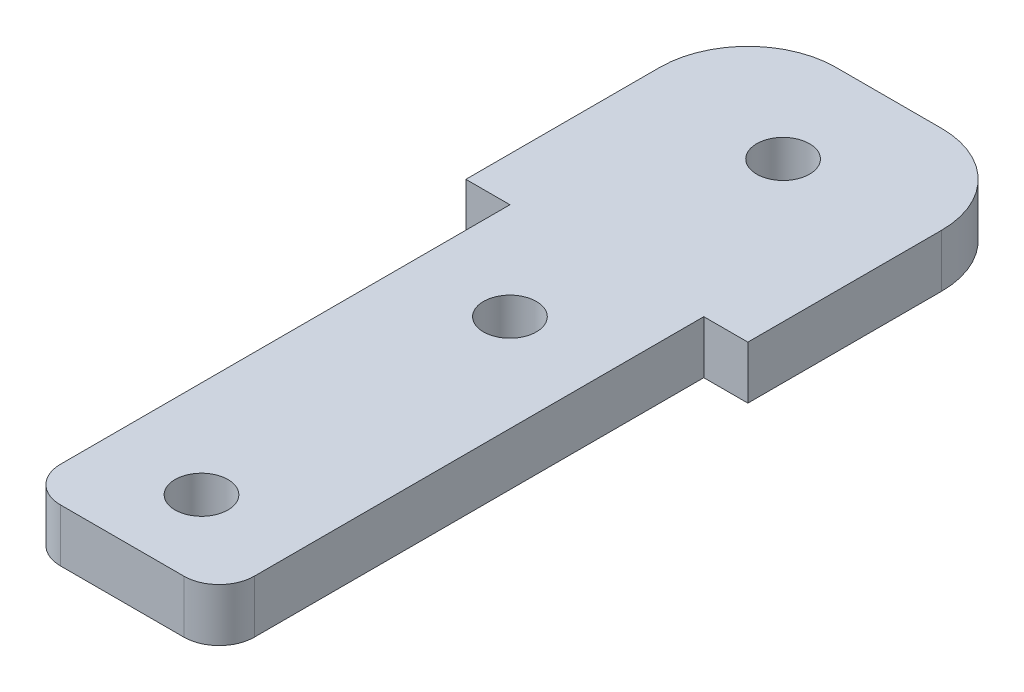
ISO-10303-21;
HEADER;
FILE_DESCRIPTION(('STEP AP214'),'2;1');
FILE_NAME('part.step','',(''),(''),'','','');
FILE_SCHEMA(('AUTOMOTIVE_DESIGN { 1 0 10303 214 1 1 1 1 }'));
ENDSEC;
DATA;
#1=APPLICATION_CONTEXT('core data for automotive mechanical design processes');
#2=APPLICATION_PROTOCOL_DEFINITION('international standard','automotive_design',2000,#1);
#3=PRODUCT_CONTEXT('',#1,'mechanical');
#4=PRODUCT('Part','Part','',(#3));
#5=PRODUCT_RELATED_PRODUCT_CATEGORY('part','',(#4));
#6=PRODUCT_DEFINITION_FORMATION('','',#4);
#7=PRODUCT_DEFINITION_CONTEXT('part definition',#1,'design');
#8=PRODUCT_DEFINITION('design','',#6,#7);
#9=PRODUCT_DEFINITION_SHAPE('','',#8);
#10=(LENGTH_UNIT() NAMED_UNIT(*) SI_UNIT(.MILLI.,.METRE.));
#11=(NAMED_UNIT(*) PLANE_ANGLE_UNIT() SI_UNIT($,.RADIAN.));
#12=(NAMED_UNIT(*) SI_UNIT($,.STERADIAN.) SOLID_ANGLE_UNIT());
#13=UNCERTAINTY_MEASURE_WITH_UNIT(LENGTH_MEASURE(1.E-05),#10,'distance_accuracy_value','');
#14=(GEOMETRIC_REPRESENTATION_CONTEXT(3) GLOBAL_UNCERTAINTY_ASSIGNED_CONTEXT((#13)) GLOBAL_UNIT_ASSIGNED_CONTEXT((#10,
#11,#12)) REPRESENTATION_CONTEXT('',''));
#15=CARTESIAN_POINT('',(0.,0.,0.));
#16=DIRECTION('',(0.,0.,1.));
#17=DIRECTION('',(1.,0.,0.));
#18=AXIS2_PLACEMENT_3D('',#15,#16,#17);
#19=CARTESIAN_POINT('',(-5.5,3.,0.));
#20=DIRECTION('',(1.,0.,0.));
#21=DIRECTION('',(0.,0.,-1.));
#22=AXIS2_PLACEMENT_3D('',#19,#20,#21);
#23=PLANE('',#22);
#24=DIRECTION('',(0.,0.,1.));
#25=VECTOR('',#24,1.);
#26=CARTESIAN_POINT('',(-5.5,0.,0.));
#27=LINE('',#26,#25);
#28=CARTESIAN_POINT('',(-5.5,0.,0.));
#29=VERTEX_POINT('',#28);
#30=CARTESIAN_POINT('',(-5.5,0.,25.5));
#31=VERTEX_POINT('',#30);
#32=EDGE_CURVE('E153',#29,#31,#27,.T.);
#33=ORIENTED_EDGE('',*,*,#32,.T.);
#34=DIRECTION('',(0.,-1.,0.));
#35=VECTOR('',#34,1.);
#36=CARTESIAN_POINT('',(-5.5,3.,25.5));
#37=LINE('',#36,#35);
#38=CARTESIAN_POINT('',(-5.5,3.,25.5));
#39=VERTEX_POINT('',#38);
#40=EDGE_CURVE('E11',#39,#31,#37,.T.);
#41=ORIENTED_EDGE('',*,*,#40,.F.);
#42=DIRECTION('',(0.,0.,1.));
#43=VECTOR('',#42,1.);
#44=CARTESIAN_POINT('',(-5.5,3.,0.));
#45=LINE('',#44,#43);
#46=CARTESIAN_POINT('',(-5.5,3.,0.));
#47=VERTEX_POINT('',#46);
#48=EDGE_CURVE('E201',#47,#39,#45,.T.);
#49=ORIENTED_EDGE('',*,*,#48,.F.);
#50=DIRECTION('',(0.,-1.,0.));
#51=VECTOR('',#50,1.);
#52=CARTESIAN_POINT('',(-5.5,3.,0.));
#53=LINE('',#52,#51);
#54=EDGE_CURVE('E170',#47,#29,#53,.T.);
#55=ORIENTED_EDGE('',*,*,#54,.T.);
#56=EDGE_LOOP('',(#33,#41,#49,#55));
#57=FACE_BOUND('',#56,.T.);
#58=ADVANCED_FACE('F34',(#57),#23,.F.);
#59=CARTESIAN_POINT('',(-3.5,3.,25.5));
#60=DIRECTION('',(0.,-1.,0.));
#61=DIRECTION('',(0.,0.,-1.));
#62=AXIS2_PLACEMENT_3D('',#59,#60,#61);
#63=CYLINDRICAL_SURFACE('',#62,2.);
#64=CARTESIAN_POINT('',(-3.5,0.,25.5));
#65=DIRECTION('',(0.,1.,0.));
#66=DIRECTION('',(0.,0.,1.));
#67=AXIS2_PLACEMENT_3D('',#64,#65,#66);
#68=CIRCLE('',#67,2.);
#69=CARTESIAN_POINT('',(-3.49999999999998,0.,27.5));
#70=VERTEX_POINT('',#69);
#71=EDGE_CURVE('E156',#31,#70,#68,.T.);
#72=ORIENTED_EDGE('',*,*,#71,.T.);
#73=DIRECTION('',(0.,-1.,0.));
#74=VECTOR('',#73,1.);
#75=CARTESIAN_POINT('',(-3.49999999999998,3.,27.5));
#76=LINE('',#75,#74);
#77=CARTESIAN_POINT('',(-3.49999999999998,3.,27.5));
#78=VERTEX_POINT('',#77);
#79=EDGE_CURVE('E43',#78,#70,#76,.T.);
#80=ORIENTED_EDGE('',*,*,#79,.F.);
#81=CARTESIAN_POINT('',(-3.5,3.,25.5));
#82=DIRECTION('',(0.,1.,0.));
#83=DIRECTION('',(0.,0.,1.));
#84=AXIS2_PLACEMENT_3D('',#81,#82,#83);
#85=CIRCLE('',#84,2.);
#86=EDGE_CURVE('E95',#39,#78,#85,.T.);
#87=ORIENTED_EDGE('',*,*,#86,.F.);
#88=ORIENTED_EDGE('',*,*,#40,.T.);
#89=EDGE_LOOP('',(#72,#80,#87,#88));
#90=FACE_BOUND('',#89,.T.);
#91=ADVANCED_FACE('F264',(#90),#63,.T.);
#92=CARTESIAN_POINT('',(0.,3.,27.5));
#93=DIRECTION('',(0.,0.,-1.));
#94=DIRECTION('',(-1.,0.,0.));
#95=AXIS2_PLACEMENT_3D('',#92,#93,#94);
#96=PLANE('',#95);
#97=DIRECTION('',(1.,0.,0.));
#98=VECTOR('',#97,1.);
#99=CARTESIAN_POINT('',(0.,0.,27.5));
#100=LINE('',#99,#98);
#101=CARTESIAN_POINT('',(3.49999999999999,0.,27.5));
#102=VERTEX_POINT('',#101);
#103=EDGE_CURVE('E158',#70,#102,#100,.T.);
#104=ORIENTED_EDGE('',*,*,#103,.T.);
#105=DIRECTION('',(0.,-1.,0.));
#106=VECTOR('',#105,1.);
#107=CARTESIAN_POINT('',(3.49999999999999,3.,27.5));
#108=LINE('',#107,#106);
#109=CARTESIAN_POINT('',(3.49999999999999,3.,27.5));
#110=VERTEX_POINT('',#109);
#111=EDGE_CURVE('E176',#110,#102,#108,.T.);
#112=ORIENTED_EDGE('',*,*,#111,.F.);
#113=DIRECTION('',(1.,0.,0.));
#114=VECTOR('',#113,1.);
#115=CARTESIAN_POINT('',(0.,3.,27.5));
#116=LINE('',#115,#114);
#117=EDGE_CURVE('E184',#78,#110,#116,.T.);
#118=ORIENTED_EDGE('',*,*,#117,.F.);
#119=ORIENTED_EDGE('',*,*,#79,.T.);
#120=EDGE_LOOP('',(#104,#112,#118,#119));
#121=FACE_BOUND('',#120,.T.);
#122=ADVANCED_FACE('F182',(#121),#96,.F.);
#123=CARTESIAN_POINT('',(3.5,3.,25.5));
#124=DIRECTION('',(0.,-1.,0.));
#125=DIRECTION('',(0.,0.,-1.));
#126=AXIS2_PLACEMENT_3D('',#123,#124,#125);
#127=CYLINDRICAL_SURFACE('',#126,2.);
#128=CARTESIAN_POINT('',(3.5,0.,25.5));
#129=DIRECTION('',(0.,1.,0.));
#130=DIRECTION('',(0.,0.,1.));
#131=AXIS2_PLACEMENT_3D('',#128,#129,#130);
#132=CIRCLE('',#131,2.);
#133=CARTESIAN_POINT('',(5.5,0.,25.5));
#134=VERTEX_POINT('',#133);
#135=EDGE_CURVE('E160',#102,#134,#132,.T.);
#136=ORIENTED_EDGE('',*,*,#135,.T.);
#137=DIRECTION('',(0.,-1.,0.));
#138=VECTOR('',#137,1.);
#139=CARTESIAN_POINT('',(5.5,3.,25.5));
#140=LINE('',#139,#138);
#141=CARTESIAN_POINT('',(5.5,3.,25.5));
#142=VERTEX_POINT('',#141);
#143=EDGE_CURVE('E174',#142,#134,#140,.T.);
#144=ORIENTED_EDGE('',*,*,#143,.F.);
#145=CARTESIAN_POINT('',(3.5,3.,25.5));
#146=DIRECTION('',(0.,1.,0.));
#147=DIRECTION('',(0.,0.,1.));
#148=AXIS2_PLACEMENT_3D('',#145,#146,#147);
#149=CIRCLE('',#148,2.);
#150=EDGE_CURVE('E196',#110,#142,#149,.T.);
#151=ORIENTED_EDGE('',*,*,#150,.F.);
#152=ORIENTED_EDGE('',*,*,#111,.T.);
#153=EDGE_LOOP('',(#136,#144,#151,#152));
#154=FACE_BOUND('',#153,.T.);
#155=ADVANCED_FACE('F194',(#154),#127,.T.);
#156=CARTESIAN_POINT('',(5.5,3.,0.));
#157=DIRECTION('',(1.,0.,0.));
#158=DIRECTION('',(0.,0.,-1.));
#159=AXIS2_PLACEMENT_3D('',#156,#157,#158);
#160=PLANE('',#159);
#161=DIRECTION('',(0.,0.,1.));
#162=VECTOR('',#161,1.);
#163=CARTESIAN_POINT('',(5.5,0.,0.));
#164=LINE('',#163,#162);
#165=CARTESIAN_POINT('',(5.5,0.,0.));
#166=VERTEX_POINT('',#165);
#167=EDGE_CURVE('E163',#166,#134,#164,.T.);
#168=ORIENTED_EDGE('',*,*,#167,.F.);
#169=DIRECTION('',(0.,-1.,0.));
#170=VECTOR('',#169,1.);
#171=CARTESIAN_POINT('',(5.5,3.,0.));
#172=LINE('',#171,#170);
#173=CARTESIAN_POINT('',(5.5,3.,0.));
#174=VERTEX_POINT('',#173);
#175=EDGE_CURVE('E134',#174,#166,#172,.T.);
#176=ORIENTED_EDGE('',*,*,#175,.F.);
#177=DIRECTION('',(0.,0.,1.));
#178=VECTOR('',#177,1.);
#179=CARTESIAN_POINT('',(5.5,3.,0.));
#180=LINE('',#179,#178);
#181=EDGE_CURVE('E123',#174,#142,#180,.T.);
#182=ORIENTED_EDGE('',*,*,#181,.T.);
#183=ORIENTED_EDGE('',*,*,#143,.T.);
#184=EDGE_LOOP('',(#168,#176,#182,#183));
#185=FACE_BOUND('',#184,.T.);
#186=ADVANCED_FACE('F292',(#185),#160,.T.);
#187=CARTESIAN_POINT('',(0.,3.,0.));
#188=DIRECTION('',(0.,0.,-1.));
#189=DIRECTION('',(-1.,0.,0.));
#190=AXIS2_PLACEMENT_3D('',#187,#188,#189);
#191=PLANE('',#190);
#192=DIRECTION('',(1.,0.,0.));
#193=VECTOR('',#192,1.);
#194=CARTESIAN_POINT('',(0.,0.,0.));
#195=LINE('',#194,#193);
#196=CARTESIAN_POINT('',(8.,0.,0.));
#197=VERTEX_POINT('',#196);
#198=EDGE_CURVE('E130',#166,#197,#195,.T.);
#199=ORIENTED_EDGE('',*,*,#198,.T.);
#200=DIRECTION('',(0.,-1.,0.));
#201=VECTOR('',#200,1.);
#202=CARTESIAN_POINT('',(8.,3.,0.));
#203=LINE('',#202,#201);
#204=CARTESIAN_POINT('',(8.,3.,0.));
#205=VERTEX_POINT('',#204);
#206=EDGE_CURVE('E127',#205,#197,#203,.T.);
#207=ORIENTED_EDGE('',*,*,#206,.F.);
#208=DIRECTION('',(1.,0.,0.));
#209=VECTOR('',#208,1.);
#210=CARTESIAN_POINT('',(0.,3.,0.));
#211=LINE('',#210,#209);
#212=EDGE_CURVE('E113',#174,#205,#211,.T.);
#213=ORIENTED_EDGE('',*,*,#212,.F.);
#214=ORIENTED_EDGE('',*,*,#175,.T.);
#215=EDGE_LOOP('',(#199,#207,#213,#214));
#216=FACE_BOUND('',#215,.T.);
#217=ADVANCED_FACE('F128',(#216),#191,.F.);
#218=CARTESIAN_POINT('',(8.,3.,0.));
#219=DIRECTION('',(1.,0.,0.));
#220=DIRECTION('',(0.,0.,-1.));
#221=AXIS2_PLACEMENT_3D('',#218,#219,#220);
#222=PLANE('',#221);
#223=DIRECTION('',(0.,0.,1.));
#224=VECTOR('',#223,1.);
#225=CARTESIAN_POINT('',(8.,0.,0.));
#226=LINE('',#225,#224);
#227=CARTESIAN_POINT('',(8.,0.,-11.));
#228=VERTEX_POINT('',#227);
#229=EDGE_CURVE('E167',#228,#197,#226,.T.);
#230=ORIENTED_EDGE('',*,*,#229,.F.);
#231=DIRECTION('',(0.,1.,0.));
#232=VECTOR('',#231,1.);
#233=CARTESIAN_POINT('',(8.,0.,-11.));
#234=LINE('',#233,#232);
#235=CARTESIAN_POINT('',(8.,3.,-11.));
#236=VERTEX_POINT('',#235);
#237=EDGE_CURVE('E139',#228,#236,#234,.T.);
#238=ORIENTED_EDGE('',*,*,#237,.T.);
#239=DIRECTION('',(0.,0.,1.));
#240=VECTOR('',#239,1.);
#241=CARTESIAN_POINT('',(8.,3.,0.));
#242=LINE('',#241,#240);
#243=EDGE_CURVE('E120',#236,#205,#242,.T.);
#244=ORIENTED_EDGE('',*,*,#243,.T.);
#245=ORIENTED_EDGE('',*,*,#206,.T.);
#246=EDGE_LOOP('',(#230,#238,#244,#245));
#247=FACE_BOUND('',#246,.T.);
#248=ADVANCED_FACE('F137',(#247),#222,.T.);
#249=CARTESIAN_POINT('',(-8.,3.,0.));
#250=DIRECTION('',(1.,0.,0.));
#251=DIRECTION('',(0.,0.,-1.));
#252=AXIS2_PLACEMENT_3D('',#249,#250,#251);
#253=PLANE('',#252);
#254=DIRECTION('',(0.,0.,1.));
#255=VECTOR('',#254,1.);
#256=CARTESIAN_POINT('',(-8.,0.,0.));
#257=LINE('',#256,#255);
#258=CARTESIAN_POINT('',(-8.,0.,-11.));
#259=VERTEX_POINT('',#258);
#260=CARTESIAN_POINT('',(-8.,0.,0.));
#261=VERTEX_POINT('',#260);
#262=EDGE_CURVE('E81',#259,#261,#257,.T.);
#263=ORIENTED_EDGE('',*,*,#262,.T.);
#264=DIRECTION('',(0.,-1.,0.));
#265=VECTOR('',#264,1.);
#266=CARTESIAN_POINT('',(-8.,3.,0.));
#267=LINE('',#266,#265);
#268=CARTESIAN_POINT('',(-8.,3.,0.));
#269=VERTEX_POINT('',#268);
#270=EDGE_CURVE('E135',#269,#261,#267,.T.);
#271=ORIENTED_EDGE('',*,*,#270,.F.);
#272=DIRECTION('',(0.,0.,1.));
#273=VECTOR('',#272,1.);
#274=CARTESIAN_POINT('',(-8.,3.,0.));
#275=LINE('',#274,#273);
#276=CARTESIAN_POINT('',(-8.,3.,-11.));
#277=VERTEX_POINT('',#276);
#278=EDGE_CURVE('E141',#277,#269,#275,.T.);
#279=ORIENTED_EDGE('',*,*,#278,.F.);
#280=DIRECTION('',(0.,1.,0.));
#281=VECTOR('',#280,1.);
#282=CARTESIAN_POINT('',(-8.,0.,-11.));
#283=LINE('',#282,#281);
#284=EDGE_CURVE('E150',#259,#277,#283,.T.);
#285=ORIENTED_EDGE('',*,*,#284,.F.);
#286=EDGE_LOOP('',(#263,#271,#279,#285));
#287=FACE_BOUND('',#286,.T.);
#288=ADVANCED_FACE('F274',(#287),#253,.F.);
#289=CARTESIAN_POINT('',(0.,3.,23.));
#290=DIRECTION('',(0.,-1.,0.));
#291=DIRECTION('',(0.,0.,-1.));
#292=AXIS2_PLACEMENT_3D('',#289,#290,#291);
#293=CYLINDRICAL_SURFACE('',#292,1.5);
#294=CARTESIAN_POINT('',(0.,3.,23.));
#295=DIRECTION('',(0.,1.,0.));
#296=DIRECTION('',(0.,0.,1.));
#297=AXIS2_PLACEMENT_3D('',#294,#295,#296);
#298=CIRCLE('',#297,1.5);
#299=CARTESIAN_POINT('',(0.,3.,24.5));
#300=VERTEX_POINT('',#299);
#301=EDGE_CURVE('E203',#300,#300,#298,.T.);
#302=ORIENTED_EDGE('',*,*,#301,.T.);
#303=EDGE_LOOP('',(#302));
#304=FACE_BOUND('',#303,.T.);
#305=CARTESIAN_POINT('',(0.,0.,23.));
#306=DIRECTION('',(0.,1.,0.));
#307=DIRECTION('',(0.,0.,1.));
#308=AXIS2_PLACEMENT_3D('',#305,#306,#307);
#309=CIRCLE('',#308,1.5);
#310=CARTESIAN_POINT('',(0.,0.,24.5));
#311=VERTEX_POINT('',#310);
#312=EDGE_CURVE('E149',#311,#311,#309,.T.);
#313=ORIENTED_EDGE('',*,*,#312,.F.);
#314=EDGE_LOOP('',(#313));
#315=FACE_BOUND('',#314,.T.);
#316=ADVANCED_FACE('F272',(#304,#315),#293,.F.);
#317=CARTESIAN_POINT('',(0.,3.,5.5));
#318=DIRECTION('',(0.,-1.,0.));
#319=DIRECTION('',(0.,0.,-1.));
#320=AXIS2_PLACEMENT_3D('',#317,#318,#319);
#321=CYLINDRICAL_SURFACE('',#320,1.5);
#322=CARTESIAN_POINT('',(0.,3.,5.5));
#323=DIRECTION('',(0.,1.,0.));
#324=DIRECTION('',(0.,0.,1.));
#325=AXIS2_PLACEMENT_3D('',#322,#323,#324);
#326=CIRCLE('',#325,1.5);
#327=CARTESIAN_POINT('',(0.,3.,7.));
#328=VERTEX_POINT('',#327);
#329=EDGE_CURVE('E206',#328,#328,#326,.T.);
#330=ORIENTED_EDGE('',*,*,#329,.T.);
#331=EDGE_LOOP('',(#330));
#332=FACE_BOUND('',#331,.T.);
#333=CARTESIAN_POINT('',(0.,0.,5.5));
#334=DIRECTION('',(0.,1.,0.));
#335=DIRECTION('',(0.,0.,1.));
#336=AXIS2_PLACEMENT_3D('',#333,#334,#335);
#337=CIRCLE('',#336,1.5);
#338=CARTESIAN_POINT('',(0.,0.,7.));
#339=VERTEX_POINT('',#338);
#340=EDGE_CURVE('E146',#339,#339,#337,.T.);
#341=ORIENTED_EDGE('',*,*,#340,.F.);
#342=EDGE_LOOP('',(#341));
#343=FACE_BOUND('',#342,.T.);
#344=ADVANCED_FACE('F36',(#332,#343),#321,.F.);
#345=EDGE_CURVE('E87',#261,#29,#195,.T.);
#346=ORIENTED_EDGE('',*,*,#345,.T.);
#347=ORIENTED_EDGE('',*,*,#54,.F.);
#348=EDGE_CURVE('E51',#269,#47,#211,.T.);
#349=ORIENTED_EDGE('',*,*,#348,.F.);
#350=ORIENTED_EDGE('',*,*,#270,.T.);
#351=EDGE_LOOP('',(#346,#347,#349,#350));
#352=FACE_BOUND('',#351,.T.);
#353=ADVANCED_FACE('F260',(#352),#191,.F.);
#354=CARTESIAN_POINT('',(0.,3.,0.));
#355=DIRECTION('',(0.,1.,0.));
#356=DIRECTION('',(0.,0.,1.));
#357=AXIS2_PLACEMENT_3D('',#354,#355,#356);
#358=PLANE('',#357);
#359=CARTESIAN_POINT('',(0.,3.,-10.));
#360=DIRECTION('',(0.,-1.,0.));
#361=DIRECTION('',(0.,0.,-1.));
#362=AXIS2_PLACEMENT_3D('',#359,#360,#361);
#363=CIRCLE('',#362,1.5);
#364=CARTESIAN_POINT('',(0.,3.,-11.5));
#365=VERTEX_POINT('',#364);
#366=EDGE_CURVE('E228',#365,#365,#363,.T.);
#367=ORIENTED_EDGE('',*,*,#366,.T.);
#368=EDGE_LOOP('',(#367));
#369=FACE_BOUND('',#368,.T.);
#370=ORIENTED_EDGE('',*,*,#243,.F.);
#371=CARTESIAN_POINT('',(3.,3.,-11.));
#372=DIRECTION('',(0.,1.,0.));
#373=DIRECTION('',(0.,0.,-1.));
#374=AXIS2_PLACEMENT_3D('',#371,#372,#373);
#375=CIRCLE('',#374,5.);
#376=CARTESIAN_POINT('',(3.,3.,-16.));
#377=VERTEX_POINT('',#376);
#378=EDGE_CURVE('E226',#236,#377,#375,.T.);
#379=ORIENTED_EDGE('',*,*,#378,.T.);
#380=DIRECTION('',(-1.,0.,0.));
#381=VECTOR('',#380,1.);
#382=CARTESIAN_POINT('',(-3.,3.,-16.));
#383=LINE('',#382,#381);
#384=CARTESIAN_POINT('',(-3.,3.,-16.));
#385=VERTEX_POINT('',#384);
#386=EDGE_CURVE('E223',#377,#385,#383,.T.);
#387=ORIENTED_EDGE('',*,*,#386,.T.);
#388=CARTESIAN_POINT('',(-3.,3.,-11.));
#389=DIRECTION('',(0.,1.,0.));
#390=DIRECTION('',(0.,0.,-1.));
#391=AXIS2_PLACEMENT_3D('',#388,#389,#390);
#392=CIRCLE('',#391,5.);
#393=EDGE_CURVE('E219',#385,#277,#392,.T.);
#394=ORIENTED_EDGE('',*,*,#393,.T.);
#395=ORIENTED_EDGE('',*,*,#278,.T.);
#396=ORIENTED_EDGE('',*,*,#348,.T.);
#397=ORIENTED_EDGE('',*,*,#48,.T.);
#398=ORIENTED_EDGE('',*,*,#86,.T.);
#399=ORIENTED_EDGE('',*,*,#117,.T.);
#400=ORIENTED_EDGE('',*,*,#150,.T.);
#401=ORIENTED_EDGE('',*,*,#181,.F.);
#402=ORIENTED_EDGE('',*,*,#212,.T.);
#403=EDGE_LOOP('',(#370,#379,#387,#394,#395,#396,#397,#398,#399,#400,#401,#402));
#404=FACE_BOUND('',#403,.T.);
#405=ORIENTED_EDGE('',*,*,#329,.F.);
#406=EDGE_LOOP('',(#405));
#407=FACE_BOUND('',#406,.T.);
#408=ORIENTED_EDGE('',*,*,#301,.F.);
#409=EDGE_LOOP('',(#408));
#410=FACE_BOUND('',#409,.T.);
#411=ADVANCED_FACE('F115',(#369,#404,#407,#410),#358,.T.);
#412=CARTESIAN_POINT('',(0.,0.,0.));
#413=DIRECTION('',(0.,1.,0.));
#414=DIRECTION('',(0.,0.,1.));
#415=AXIS2_PLACEMENT_3D('',#412,#413,#414);
#416=PLANE('',#415);
#417=CARTESIAN_POINT('',(0.,0.,-10.));
#418=DIRECTION('',(0.,-1.,0.));
#419=DIRECTION('',(0.,0.,-1.));
#420=AXIS2_PLACEMENT_3D('',#417,#418,#419);
#421=CIRCLE('',#420,1.5);
#422=CARTESIAN_POINT('',(0.,0.,-11.5));
#423=VERTEX_POINT('',#422);
#424=EDGE_CURVE('E236',#423,#423,#421,.T.);
#425=ORIENTED_EDGE('',*,*,#424,.F.);
#426=EDGE_LOOP('',(#425));
#427=FACE_BOUND('',#426,.T.);
#428=CARTESIAN_POINT('',(3.,0.,-11.));
#429=DIRECTION('',(0.,1.,0.));
#430=DIRECTION('',(0.,0.,-1.));
#431=AXIS2_PLACEMENT_3D('',#428,#429,#430);
#432=CIRCLE('',#431,5.);
#433=CARTESIAN_POINT('',(3.,0.,-16.));
#434=VERTEX_POINT('',#433);
#435=EDGE_CURVE('E222',#228,#434,#432,.T.);
#436=ORIENTED_EDGE('',*,*,#435,.F.);
#437=ORIENTED_EDGE('',*,*,#229,.T.);
#438=ORIENTED_EDGE('',*,*,#198,.F.);
#439=ORIENTED_EDGE('',*,*,#167,.T.);
#440=ORIENTED_EDGE('',*,*,#135,.F.);
#441=ORIENTED_EDGE('',*,*,#103,.F.);
#442=ORIENTED_EDGE('',*,*,#71,.F.);
#443=ORIENTED_EDGE('',*,*,#32,.F.);
#444=ORIENTED_EDGE('',*,*,#345,.F.);
#445=ORIENTED_EDGE('',*,*,#262,.F.);
#446=CARTESIAN_POINT('',(-3.,0.,-11.));
#447=DIRECTION('',(0.,1.,0.));
#448=DIRECTION('',(0.,0.,-1.));
#449=AXIS2_PLACEMENT_3D('',#446,#447,#448);
#450=CIRCLE('',#449,5.);
#451=CARTESIAN_POINT('',(-3.,0.,-16.));
#452=VERTEX_POINT('',#451);
#453=EDGE_CURVE('E211',#452,#259,#450,.T.);
#454=ORIENTED_EDGE('',*,*,#453,.F.);
#455=DIRECTION('',(-1.,0.,0.));
#456=VECTOR('',#455,1.);
#457=CARTESIAN_POINT('',(-3.,0.,-16.));
#458=LINE('',#457,#456);
#459=EDGE_CURVE('E231',#434,#452,#458,.T.);
#460=ORIENTED_EDGE('',*,*,#459,.F.);
#461=EDGE_LOOP('',(#436,#437,#438,#439,#440,#441,#442,#443,#444,#445,#454,#460));
#462=FACE_BOUND('',#461,.T.);
#463=ORIENTED_EDGE('',*,*,#340,.T.);
#464=EDGE_LOOP('',(#463));
#465=FACE_BOUND('',#464,.T.);
#466=ORIENTED_EDGE('',*,*,#312,.T.);
#467=EDGE_LOOP('',(#466));
#468=FACE_BOUND('',#467,.T.);
#469=ADVANCED_FACE('F188',(#427,#462,#465,#468),#416,.F.);
#470=CARTESIAN_POINT('',(-3.,0.,-11.));
#471=DIRECTION('',(0.,1.,0.));
#472=DIRECTION('',(0.,0.,1.));
#473=AXIS2_PLACEMENT_3D('',#470,#471,#472);
#474=CYLINDRICAL_SURFACE('',#473,5.);
#475=ORIENTED_EDGE('',*,*,#393,.F.);
#476=DIRECTION('',(0.,1.,0.));
#477=VECTOR('',#476,1.);
#478=CARTESIAN_POINT('',(-3.,0.,-16.));
#479=LINE('',#478,#477);
#480=EDGE_CURVE('E214',#452,#385,#479,.T.);
#481=ORIENTED_EDGE('',*,*,#480,.F.);
#482=ORIENTED_EDGE('',*,*,#453,.T.);
#483=ORIENTED_EDGE('',*,*,#284,.T.);
#484=EDGE_LOOP('',(#475,#481,#482,#483));
#485=FACE_BOUND('',#484,.T.);
#486=ADVANCED_FACE('F251',(#485),#474,.T.);
#487=CARTESIAN_POINT('',(-3.,0.,-16.));
#488=DIRECTION('',(0.,0.,-1.));
#489=DIRECTION('',(-1.,0.,0.));
#490=AXIS2_PLACEMENT_3D('',#487,#488,#489);
#491=PLANE('',#490);
#492=ORIENTED_EDGE('',*,*,#386,.F.);
#493=DIRECTION('',(0.,1.,0.));
#494=VECTOR('',#493,1.);
#495=CARTESIAN_POINT('',(3.,0.,-16.));
#496=LINE('',#495,#494);
#497=EDGE_CURVE('E210',#434,#377,#496,.T.);
#498=ORIENTED_EDGE('',*,*,#497,.F.);
#499=ORIENTED_EDGE('',*,*,#459,.T.);
#500=ORIENTED_EDGE('',*,*,#480,.T.);
#501=EDGE_LOOP('',(#492,#498,#499,#500));
#502=FACE_BOUND('',#501,.T.);
#503=ADVANCED_FACE('F257',(#502),#491,.T.);
#504=CARTESIAN_POINT('',(3.,0.,-11.));
#505=DIRECTION('',(0.,1.,0.));
#506=DIRECTION('',(0.,0.,1.));
#507=AXIS2_PLACEMENT_3D('',#504,#505,#506);
#508=CYLINDRICAL_SURFACE('',#507,5.);
#509=ORIENTED_EDGE('',*,*,#378,.F.);
#510=ORIENTED_EDGE('',*,*,#237,.F.);
#511=ORIENTED_EDGE('',*,*,#435,.T.);
#512=ORIENTED_EDGE('',*,*,#497,.T.);
#513=EDGE_LOOP('',(#509,#510,#511,#512));
#514=FACE_BOUND('',#513,.T.);
#515=ADVANCED_FACE('F246',(#514),#508,.T.);
#516=CARTESIAN_POINT('',(0.,3.,-10.));
#517=DIRECTION('',(0.,-1.,0.));
#518=DIRECTION('',(0.,0.,-1.));
#519=AXIS2_PLACEMENT_3D('',#516,#517,#518);
#520=CYLINDRICAL_SURFACE('',#519,1.5);
#521=ORIENTED_EDGE('',*,*,#366,.F.);
#522=EDGE_LOOP('',(#521));
#523=FACE_BOUND('',#522,.T.);
#524=ORIENTED_EDGE('',*,*,#424,.T.);
#525=EDGE_LOOP('',(#524));
#526=FACE_BOUND('',#525,.T.);
#527=ADVANCED_FACE('F243',(#523,#526),#520,.F.);
#528=CLOSED_SHELL('',(#58,#91,#122,#155,#186,#217,#248,#288,#316,#344,#353,#411,#469,#486,#503,
#515,#527));
#529=MANIFOLD_SOLID_BREP('B2',#528);
#530=ADVANCED_BREP_SHAPE_REPRESENTATION('',(#18,#529),#14);
#531=SHAPE_DEFINITION_REPRESENTATION(#9,#530);
ENDSEC;
END-ISO-10303-21;
